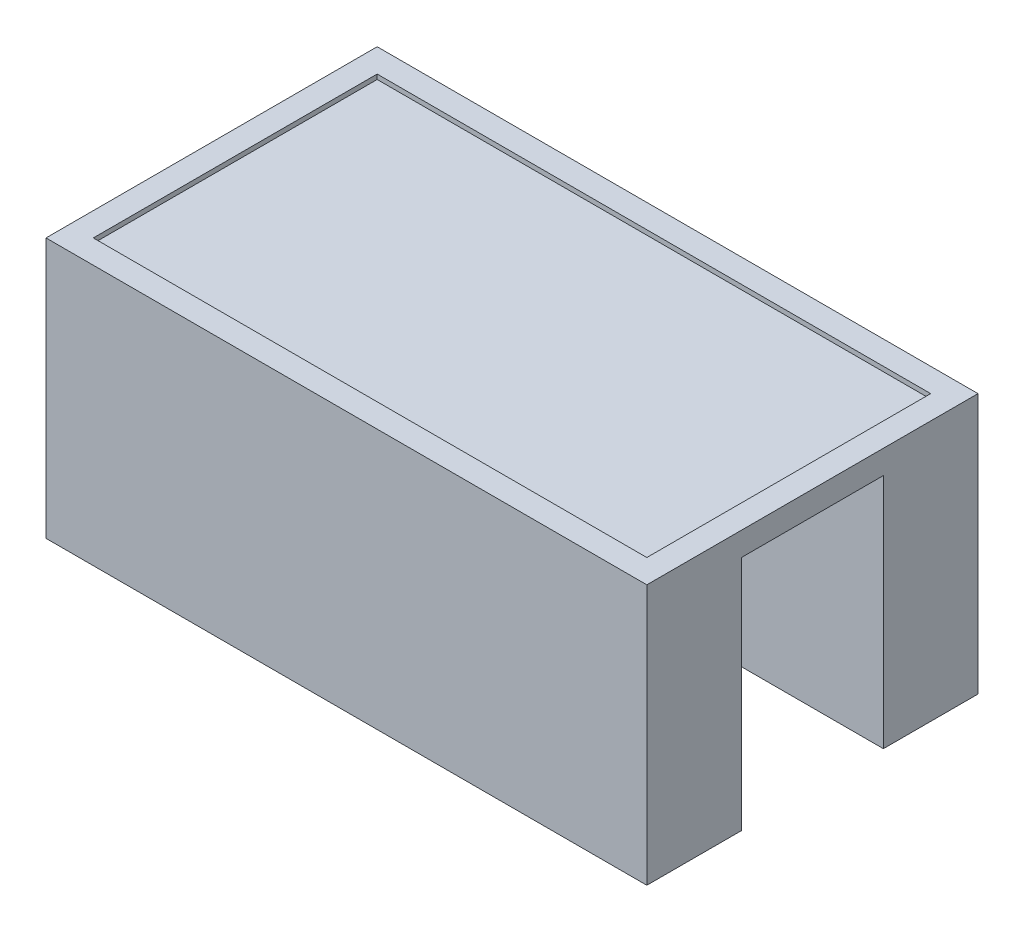
ISO-10303-21;
HEADER;
FILE_DESCRIPTION(('STEP AP214'),'2;1');
FILE_NAME('part.step','',(''),(''),'','','');
FILE_SCHEMA(('AUTOMOTIVE_DESIGN { 1 0 10303 214 1 1 1 1 }'));
ENDSEC;
DATA;
#1=APPLICATION_CONTEXT('core data for automotive mechanical design processes');
#2=APPLICATION_PROTOCOL_DEFINITION('international standard','automotive_design',2000,#1);
#3=PRODUCT_CONTEXT('',#1,'mechanical');
#4=PRODUCT('Part','Part','',(#3));
#5=PRODUCT_RELATED_PRODUCT_CATEGORY('part','',(#4));
#6=PRODUCT_DEFINITION_FORMATION('','',#4);
#7=PRODUCT_DEFINITION_CONTEXT('part definition',#1,'design');
#8=PRODUCT_DEFINITION('design','',#6,#7);
#9=PRODUCT_DEFINITION_SHAPE('','',#8);
#10=(LENGTH_UNIT() NAMED_UNIT(*) SI_UNIT(.MILLI.,.METRE.));
#11=(NAMED_UNIT(*) PLANE_ANGLE_UNIT() SI_UNIT($,.RADIAN.));
#12=(NAMED_UNIT(*) SI_UNIT($,.STERADIAN.) SOLID_ANGLE_UNIT());
#13=UNCERTAINTY_MEASURE_WITH_UNIT(LENGTH_MEASURE(1.E-05),#10,'distance_accuracy_value','');
#14=(GEOMETRIC_REPRESENTATION_CONTEXT(3) GLOBAL_UNCERTAINTY_ASSIGNED_CONTEXT((#13)) GLOBAL_UNIT_ASSIGNED_CONTEXT((#10,
#11,#12)) REPRESENTATION_CONTEXT('',''));
#15=CARTESIAN_POINT('',(0.,0.,0.));
#16=DIRECTION('',(0.,0.,1.));
#17=DIRECTION('',(1.,0.,0.));
#18=AXIS2_PLACEMENT_3D('',#15,#16,#17);
#19=CARTESIAN_POINT('',(0.,27.,0.));
#20=DIRECTION('',(0.,-1.,0.));
#21=DIRECTION('',(0.,0.,-1.));
#22=AXIS2_PLACEMENT_3D('',#19,#20,#21);
#23=PLANE('',#22);
#24=DIRECTION('',(0.,0.,-1.));
#25=VECTOR('',#24,1.);
#26=CARTESIAN_POINT('',(3.5,27.,11.5));
#27=LINE('',#26,#25);
#28=CARTESIAN_POINT('',(3.5,27.,-5.));
#29=VERTEX_POINT('',#28);
#30=CARTESIAN_POINT('',(3.50000000000001,27.,-11.5));
#31=VERTEX_POINT('',#30);
#32=EDGE_CURVE('E270',#29,#31,#27,.T.);
#33=ORIENTED_EDGE('',*,*,#32,.F.);
#34=DIRECTION('',(-1.,0.,0.));
#35=VECTOR('',#34,1.);
#36=CARTESIAN_POINT('',(-7.5,27.,-5.));
#37=LINE('',#36,#35);
#38=CARTESIAN_POINT('',(-7.5,27.,-5.));
#39=VERTEX_POINT('',#38);
#40=EDGE_CURVE('E463',#29,#39,#37,.T.);
#41=ORIENTED_EDGE('',*,*,#40,.T.);
#42=DIRECTION('',(0.,0.,-1.));
#43=VECTOR('',#42,1.);
#44=CARTESIAN_POINT('',(-7.5,27.,11.5));
#45=LINE('',#44,#43);
#46=CARTESIAN_POINT('',(-7.5,27.,-11.5));
#47=VERTEX_POINT('',#46);
#48=EDGE_CURVE('E311',#39,#47,#45,.T.);
#49=ORIENTED_EDGE('',*,*,#48,.T.);
#50=DIRECTION('',(1.,0.,0.));
#51=VECTOR('',#50,1.);
#52=CARTESIAN_POINT('',(-7.5,27.,-11.5));
#53=LINE('',#52,#51);
#54=EDGE_CURVE('E316',#47,#31,#53,.T.);
#55=ORIENTED_EDGE('',*,*,#54,.T.);
#56=EDGE_LOOP('',(#33,#41,#49,#55));
#57=FACE_BOUND('',#56,.T.);
#58=ADVANCED_FACE('F38',(#57),#23,.T.);
#59=CARTESIAN_POINT('',(-7.5,27.,11.5));
#60=VERTEX_POINT('',#59);
#61=CARTESIAN_POINT('',(-7.5,27.,5.));
#62=VERTEX_POINT('',#61);
#63=EDGE_CURVE('E312',#60,#62,#45,.T.);
#64=ORIENTED_EDGE('',*,*,#63,.T.);
#65=DIRECTION('',(1.,0.,0.));
#66=VECTOR('',#65,1.);
#67=CARTESIAN_POINT('',(-7.5,27.,5.));
#68=LINE('',#67,#66);
#69=CARTESIAN_POINT('',(3.50000000000001,27.,5.));
#70=VERTEX_POINT('',#69);
#71=EDGE_CURVE('E250',#62,#70,#68,.T.);
#72=ORIENTED_EDGE('',*,*,#71,.T.);
#73=CARTESIAN_POINT('',(3.5,27.,11.5));
#74=VERTEX_POINT('',#73);
#75=EDGE_CURVE('E281',#74,#70,#27,.T.);
#76=ORIENTED_EDGE('',*,*,#75,.F.);
#77=DIRECTION('',(-1.,0.,0.));
#78=VECTOR('',#77,1.);
#79=CARTESIAN_POINT('',(-7.5,27.,11.5));
#80=LINE('',#79,#78);
#81=EDGE_CURVE('E305',#74,#60,#80,.T.);
#82=ORIENTED_EDGE('',*,*,#81,.T.);
#83=EDGE_LOOP('',(#64,#72,#76,#82));
#84=FACE_BOUND('',#83,.T.);
#85=ADVANCED_FACE('F548',(#84),#23,.T.);
#86=CARTESIAN_POINT('',(7.5,27.,11.5));
#87=DIRECTION('',(-1.,0.,0.));
#88=DIRECTION('',(0.,0.,1.));
#89=AXIS2_PLACEMENT_3D('',#86,#87,#88);
#90=PLANE('',#89);
#91=DIRECTION('',(0.,-1.,0.));
#92=VECTOR('',#91,1.);
#93=CARTESIAN_POINT('',(7.5,38.5,5.));
#94=LINE('',#93,#92);
#95=CARTESIAN_POINT('',(7.50000000000001,38.5,5.));
#96=VERTEX_POINT('',#95);
#97=CARTESIAN_POINT('',(7.5,27.,5.));
#98=VERTEX_POINT('',#97);
#99=EDGE_CURVE('E234',#96,#98,#94,.T.);
#100=ORIENTED_EDGE('',*,*,#99,.F.);
#101=CARTESIAN_POINT('',(7.50000000000001,38.5,0.));
#102=DIRECTION('',(-1.,0.,0.));
#103=DIRECTION('',(0.,0.,1.));
#104=AXIS2_PLACEMENT_3D('',#101,#102,#103);
#105=CIRCLE('',#104,5.);
#106=CARTESIAN_POINT('',(7.50000000000001,38.5,-5.00000000000002));
#107=VERTEX_POINT('',#106);
#108=EDGE_CURVE('E721',#96,#107,#105,.T.);
#109=ORIENTED_EDGE('',*,*,#108,.T.);
#110=DIRECTION('',(0.,-1.,0.));
#111=VECTOR('',#110,1.);
#112=CARTESIAN_POINT('',(7.5,38.5,-5.));
#113=LINE('',#112,#111);
#114=CARTESIAN_POINT('',(7.5,27.,-5.));
#115=VERTEX_POINT('',#114);
#116=EDGE_CURVE('E255',#107,#115,#113,.T.);
#117=ORIENTED_EDGE('',*,*,#116,.T.);
#118=DIRECTION('',(0.,0.,1.));
#119=VECTOR('',#118,1.);
#120=CARTESIAN_POINT('',(7.5,27.,11.5));
#121=LINE('',#120,#119);
#122=CARTESIAN_POINT('',(7.5,27.,-11.5));
#123=VERTEX_POINT('',#122);
#124=EDGE_CURVE('E301',#123,#115,#121,.T.);
#125=ORIENTED_EDGE('',*,*,#124,.F.);
#126=DIRECTION('',(0.,1.,0.));
#127=VECTOR('',#126,1.);
#128=CARTESIAN_POINT('',(7.5,27.,-11.5));
#129=LINE('',#128,#127);
#130=CARTESIAN_POINT('',(7.5,50.,-11.5));
#131=VERTEX_POINT('',#130);
#132=EDGE_CURVE('E320',#123,#131,#129,.T.);
#133=ORIENTED_EDGE('',*,*,#132,.T.);
#134=DIRECTION('',(0.,0.,1.));
#135=VECTOR('',#134,1.);
#136=CARTESIAN_POINT('',(7.5,50.,11.5));
#137=LINE('',#136,#135);
#138=CARTESIAN_POINT('',(7.5,50.,11.5));
#139=VERTEX_POINT('',#138);
#140=EDGE_CURVE('E291',#131,#139,#137,.T.);
#141=ORIENTED_EDGE('',*,*,#140,.T.);
#142=DIRECTION('',(0.,1.,0.));
#143=VECTOR('',#142,1.);
#144=CARTESIAN_POINT('',(7.5,27.,11.5));
#145=LINE('',#144,#143);
#146=CARTESIAN_POINT('',(7.5,27.,11.5));
#147=VERTEX_POINT('',#146);
#148=EDGE_CURVE('E349',#147,#139,#145,.T.);
#149=ORIENTED_EDGE('',*,*,#148,.F.);
#150=EDGE_CURVE('E306',#98,#147,#121,.T.);
#151=ORIENTED_EDGE('',*,*,#150,.F.);
#152=EDGE_LOOP('',(#100,#109,#117,#125,#133,#141,#149,#151));
#153=FACE_BOUND('',#152,.T.);
#154=ADVANCED_FACE('F491',(#153),#90,.F.);
#155=CARTESIAN_POINT('',(-7.5,27.,11.5));
#156=DIRECTION('',(1.,0.,0.));
#157=DIRECTION('',(0.,0.,-1.));
#158=AXIS2_PLACEMENT_3D('',#155,#156,#157);
#159=PLANE('',#158);
#160=DIRECTION('',(0.,-1.,0.));
#161=VECTOR('',#160,1.);
#162=CARTESIAN_POINT('',(-7.5,38.5,-5.));
#163=LINE('',#162,#161);
#164=CARTESIAN_POINT('',(-7.5,38.5,-5.));
#165=VERTEX_POINT('',#164);
#166=EDGE_CURVE('E245',#165,#39,#163,.T.);
#167=ORIENTED_EDGE('',*,*,#166,.F.);
#168=CARTESIAN_POINT('',(-7.5,38.5,0.));
#169=DIRECTION('',(-1.,0.,0.));
#170=DIRECTION('',(0.,0.,1.));
#171=AXIS2_PLACEMENT_3D('',#168,#169,#170);
#172=CIRCLE('',#171,5.);
#173=CARTESIAN_POINT('',(-7.5,38.5,5.));
#174=VERTEX_POINT('',#173);
#175=EDGE_CURVE('E226',#174,#165,#172,.T.);
#176=ORIENTED_EDGE('',*,*,#175,.F.);
#177=DIRECTION('',(0.,-1.,0.));
#178=VECTOR('',#177,1.);
#179=CARTESIAN_POINT('',(-7.5,38.5,5.));
#180=LINE('',#179,#178);
#181=EDGE_CURVE('E242',#174,#62,#180,.T.);
#182=ORIENTED_EDGE('',*,*,#181,.T.);
#183=ORIENTED_EDGE('',*,*,#63,.F.);
#184=DIRECTION('',(0.,1.,0.));
#185=VECTOR('',#184,1.);
#186=CARTESIAN_POINT('',(-7.5,27.,11.5));
#187=LINE('',#186,#185);
#188=CARTESIAN_POINT('',(-7.5,50.,11.5));
#189=VERTEX_POINT('',#188);
#190=EDGE_CURVE('E345',#60,#189,#187,.T.);
#191=ORIENTED_EDGE('',*,*,#190,.T.);
#192=DIRECTION('',(0.,0.,-1.));
#193=VECTOR('',#192,1.);
#194=CARTESIAN_POINT('',(-7.5,50.,11.5));
#195=LINE('',#194,#193);
#196=CARTESIAN_POINT('',(-7.5,50.,-11.5));
#197=VERTEX_POINT('',#196);
#198=EDGE_CURVE('E329',#189,#197,#195,.T.);
#199=ORIENTED_EDGE('',*,*,#198,.T.);
#200=DIRECTION('',(0.,1.,0.));
#201=VECTOR('',#200,1.);
#202=CARTESIAN_POINT('',(-7.5,27.,-11.5));
#203=LINE('',#202,#201);
#204=EDGE_CURVE('E341',#47,#197,#203,.T.);
#205=ORIENTED_EDGE('',*,*,#204,.F.);
#206=ORIENTED_EDGE('',*,*,#48,.F.);
#207=EDGE_LOOP('',(#167,#176,#182,#183,#191,#199,#205,#206));
#208=FACE_BOUND('',#207,.T.);
#209=ADVANCED_FACE('F240',(#208),#159,.F.);
#210=ORIENTED_EDGE('',*,*,#124,.T.);
#211=CARTESIAN_POINT('',(6.50000000000001,27.,-5.));
#212=VERTEX_POINT('',#211);
#213=EDGE_CURVE('E497',#115,#212,#37,.T.);
#214=ORIENTED_EDGE('',*,*,#213,.T.);
#215=DIRECTION('',(0.,0.,1.));
#216=VECTOR('',#215,1.);
#217=CARTESIAN_POINT('',(6.5,27.,11.5));
#218=LINE('',#217,#216);
#219=CARTESIAN_POINT('',(6.50000000000001,27.,-11.5));
#220=VERTEX_POINT('',#219);
#221=EDGE_CURVE('E276',#220,#212,#218,.T.);
#222=ORIENTED_EDGE('',*,*,#221,.F.);
#223=EDGE_CURVE('E315',#220,#123,#53,.T.);
#224=ORIENTED_EDGE('',*,*,#223,.T.);
#225=EDGE_LOOP('',(#210,#214,#222,#224));
#226=FACE_BOUND('',#225,.T.);
#227=ADVANCED_FACE('F496',(#226),#23,.T.);
#228=CARTESIAN_POINT('',(6.50000000000001,27.,5.));
#229=VERTEX_POINT('',#228);
#230=CARTESIAN_POINT('',(6.5,27.,11.5));
#231=VERTEX_POINT('',#230);
#232=EDGE_CURVE('E285',#229,#231,#218,.T.);
#233=ORIENTED_EDGE('',*,*,#232,.F.);
#234=EDGE_CURVE('E441',#229,#98,#68,.T.);
#235=ORIENTED_EDGE('',*,*,#234,.T.);
#236=ORIENTED_EDGE('',*,*,#150,.T.);
#237=EDGE_CURVE('E307',#147,#231,#80,.T.);
#238=ORIENTED_EDGE('',*,*,#237,.T.);
#239=EDGE_LOOP('',(#233,#235,#236,#238));
#240=FACE_BOUND('',#239,.T.);
#241=ADVANCED_FACE('F448',(#240),#23,.T.);
#242=CARTESIAN_POINT('',(3.5,50.,11.5));
#243=DIRECTION('',(-1.,0.,0.));
#244=DIRECTION('',(0.,0.,1.));
#245=AXIS2_PLACEMENT_3D('',#242,#243,#244);
#246=PLANE('',#245);
#247=DIRECTION('',(0.,-1.,0.));
#248=VECTOR('',#247,1.);
#249=CARTESIAN_POINT('',(3.5,50.,5.));
#250=LINE('',#249,#248);
#251=CARTESIAN_POINT('',(3.50000000000001,38.5,5.));
#252=VERTEX_POINT('',#251);
#253=EDGE_CURVE('E263',#252,#70,#250,.T.);
#254=ORIENTED_EDGE('',*,*,#253,.F.);
#255=CARTESIAN_POINT('',(3.5,38.5,0.));
#256=DIRECTION('',(-1.,0.,0.));
#257=DIRECTION('',(0.,0.,1.));
#258=AXIS2_PLACEMENT_3D('',#255,#256,#257);
#259=CIRCLE('',#258,5.);
#260=CARTESIAN_POINT('',(3.5,38.5,-5.));
#261=VERTEX_POINT('',#260);
#262=EDGE_CURVE('E229',#252,#261,#259,.T.);
#263=ORIENTED_EDGE('',*,*,#262,.T.);
#264=DIRECTION('',(0.,1.,0.));
#265=VECTOR('',#264,1.);
#266=CARTESIAN_POINT('',(3.50000000000001,50.,-5.));
#267=LINE('',#266,#265);
#268=EDGE_CURVE('E266',#29,#261,#267,.T.);
#269=ORIENTED_EDGE('',*,*,#268,.F.);
#270=ORIENTED_EDGE('',*,*,#32,.T.);
#271=DIRECTION('',(0.,-1.,0.));
#272=VECTOR('',#271,1.);
#273=CARTESIAN_POINT('',(3.50000000000001,50.,-11.5));
#274=LINE('',#273,#272);
#275=CARTESIAN_POINT('',(3.50000000000001,50.,-11.5));
#276=VERTEX_POINT('',#275);
#277=EDGE_CURVE('E280',#276,#31,#274,.T.);
#278=ORIENTED_EDGE('',*,*,#277,.F.);
#279=DIRECTION('',(0.,0.,-1.));
#280=VECTOR('',#279,1.);
#281=CARTESIAN_POINT('',(3.5,50.,11.5));
#282=LINE('',#281,#280);
#283=CARTESIAN_POINT('',(3.5,50.,11.5));
#284=VERTEX_POINT('',#283);
#285=EDGE_CURVE('E271',#284,#276,#282,.T.);
#286=ORIENTED_EDGE('',*,*,#285,.F.);
#287=DIRECTION('',(0.,-1.,0.));
#288=VECTOR('',#287,1.);
#289=CARTESIAN_POINT('',(3.5,50.,11.5));
#290=LINE('',#289,#288);
#291=EDGE_CURVE('E288',#284,#74,#290,.T.);
#292=ORIENTED_EDGE('',*,*,#291,.T.);
#293=ORIENTED_EDGE('',*,*,#75,.T.);
#294=EDGE_LOOP('',(#254,#263,#269,#270,#278,#286,#292,#293));
#295=FACE_BOUND('',#294,.T.);
#296=ADVANCED_FACE('F456',(#295),#246,.F.);
#297=CARTESIAN_POINT('',(6.5,50.,11.5));
#298=DIRECTION('',(1.,0.,0.));
#299=DIRECTION('',(0.,0.,-1.));
#300=AXIS2_PLACEMENT_3D('',#297,#298,#299);
#301=PLANE('',#300);
#302=DIRECTION('',(0.,-1.,0.));
#303=VECTOR('',#302,1.);
#304=CARTESIAN_POINT('',(6.50000000000001,50.,-5.));
#305=LINE('',#304,#303);
#306=CARTESIAN_POINT('',(6.50000000000001,38.5,-5.));
#307=VERTEX_POINT('',#306);
#308=EDGE_CURVE('E11',#307,#212,#305,.T.);
#309=ORIENTED_EDGE('',*,*,#308,.F.);
#310=CARTESIAN_POINT('',(6.50000000000001,38.5,0.));
#311=DIRECTION('',(1.,0.,0.));
#312=DIRECTION('',(0.,0.,-1.));
#313=AXIS2_PLACEMENT_3D('',#310,#311,#312);
#314=CIRCLE('',#313,5.);
#315=CARTESIAN_POINT('',(6.50000000000001,38.5,5.));
#316=VERTEX_POINT('',#315);
#317=EDGE_CURVE('E446',#307,#316,#314,.T.);
#318=ORIENTED_EDGE('',*,*,#317,.T.);
#319=DIRECTION('',(0.,1.,0.));
#320=VECTOR('',#319,1.);
#321=CARTESIAN_POINT('',(6.50000000000001,50.,5.));
#322=LINE('',#321,#320);
#323=EDGE_CURVE('E47',#229,#316,#322,.T.);
#324=ORIENTED_EDGE('',*,*,#323,.F.);
#325=ORIENTED_EDGE('',*,*,#232,.T.);
#326=DIRECTION('',(0.,-1.,0.));
#327=VECTOR('',#326,1.);
#328=CARTESIAN_POINT('',(6.5,50.,11.5));
#329=LINE('',#328,#327);
#330=CARTESIAN_POINT('',(6.5,50.,11.5));
#331=VERTEX_POINT('',#330);
#332=EDGE_CURVE('E292',#331,#231,#329,.T.);
#333=ORIENTED_EDGE('',*,*,#332,.F.);
#334=DIRECTION('',(0.,0.,1.));
#335=VECTOR('',#334,1.);
#336=CARTESIAN_POINT('',(6.5,50.,11.5));
#337=LINE('',#336,#335);
#338=CARTESIAN_POINT('',(6.50000000000001,50.,-11.5));
#339=VERTEX_POINT('',#338);
#340=EDGE_CURVE('E275',#339,#331,#337,.T.);
#341=ORIENTED_EDGE('',*,*,#340,.F.);
#342=DIRECTION('',(0.,-1.,0.));
#343=VECTOR('',#342,1.);
#344=CARTESIAN_POINT('',(6.50000000000001,50.,-11.5));
#345=LINE('',#344,#343);
#346=EDGE_CURVE('E62',#339,#220,#345,.T.);
#347=ORIENTED_EDGE('',*,*,#346,.T.);
#348=ORIENTED_EDGE('',*,*,#221,.T.);
#349=EDGE_LOOP('',(#309,#318,#324,#325,#333,#341,#347,#348));
#350=FACE_BOUND('',#349,.T.);
#351=ADVANCED_FACE('F445',(#350),#301,.F.);
#352=CARTESIAN_POINT('',(-7.5,27.,11.5));
#353=DIRECTION('',(0.,0.,-1.));
#354=DIRECTION('',(-1.,0.,0.));
#355=AXIS2_PLACEMENT_3D('',#352,#353,#354);
#356=PLANE('',#355);
#357=ORIENTED_EDGE('',*,*,#81,.F.);
#358=ORIENTED_EDGE('',*,*,#291,.F.);
#359=DIRECTION('',(-1.,0.,0.));
#360=VECTOR('',#359,1.);
#361=CARTESIAN_POINT('',(-7.5,50.,11.5));
#362=LINE('',#361,#360);
#363=EDGE_CURVE('E324',#284,#189,#362,.T.);
#364=ORIENTED_EDGE('',*,*,#363,.T.);
#365=ORIENTED_EDGE('',*,*,#190,.F.);
#366=EDGE_LOOP('',(#357,#358,#364,#365));
#367=FACE_BOUND('',#366,.T.);
#368=ADVANCED_FACE('F475',(#367),#356,.F.);
#369=CARTESIAN_POINT('',(-7.5,27.,-11.5));
#370=DIRECTION('',(0.,0.,1.));
#371=DIRECTION('',(1.,0.,0.));
#372=AXIS2_PLACEMENT_3D('',#369,#370,#371);
#373=PLANE('',#372);
#374=DIRECTION('',(1.,0.,0.));
#375=VECTOR('',#374,1.);
#376=CARTESIAN_POINT('',(-7.5,50.,-11.5));
#377=LINE('',#376,#375);
#378=EDGE_CURVE('E334',#197,#276,#377,.T.);
#379=ORIENTED_EDGE('',*,*,#378,.T.);
#380=ORIENTED_EDGE('',*,*,#277,.T.);
#381=ORIENTED_EDGE('',*,*,#54,.F.);
#382=ORIENTED_EDGE('',*,*,#204,.T.);
#383=EDGE_LOOP('',(#379,#380,#381,#382));
#384=FACE_BOUND('',#383,.T.);
#385=ADVANCED_FACE('F461',(#384),#373,.F.);
#386=CARTESIAN_POINT('',(0.,50.,0.));
#387=DIRECTION('',(0.,1.,0.));
#388=DIRECTION('',(0.,0.,1.));
#389=AXIS2_PLACEMENT_3D('',#386,#387,#388);
#390=PLANE('',#389);
#391=ORIENTED_EDGE('',*,*,#363,.F.);
#392=ORIENTED_EDGE('',*,*,#285,.T.);
#393=ORIENTED_EDGE('',*,*,#378,.F.);
#394=ORIENTED_EDGE('',*,*,#198,.F.);
#395=EDGE_LOOP('',(#391,#392,#393,#394));
#396=FACE_BOUND('',#395,.T.);
#397=DIRECTION('',(0.,0.,-1.));
#398=VECTOR('',#397,1.);
#399=CARTESIAN_POINT('',(63.5,50.,-15.));
#400=LINE('',#399,#398);
#401=CARTESIAN_POINT('',(63.5,50.,15.));
#402=VERTEX_POINT('',#401);
#403=CARTESIAN_POINT('',(63.5,50.,-15.));
#404=VERTEX_POINT('',#403);
#405=EDGE_CURVE('E354',#402,#404,#400,.T.);
#406=ORIENTED_EDGE('',*,*,#405,.F.);
#407=DIRECTION('',(1.,0.,0.));
#408=VECTOR('',#407,1.);
#409=CARTESIAN_POINT('',(-63.5,50.,15.));
#410=LINE('',#409,#408);
#411=CARTESIAN_POINT('',(-63.5,50.,15.));
#412=VERTEX_POINT('',#411);
#413=EDGE_CURVE('E366',#412,#402,#410,.T.);
#414=ORIENTED_EDGE('',*,*,#413,.F.);
#415=DIRECTION('',(0.,0.,1.));
#416=VECTOR('',#415,1.);
#417=CARTESIAN_POINT('',(-63.5,50.,-15.));
#418=LINE('',#417,#416);
#419=CARTESIAN_POINT('',(-63.5,50.,-15.));
#420=VERTEX_POINT('',#419);
#421=EDGE_CURVE('E362',#420,#412,#418,.T.);
#422=ORIENTED_EDGE('',*,*,#421,.F.);
#423=DIRECTION('',(-1.,0.,0.));
#424=VECTOR('',#423,1.);
#425=CARTESIAN_POINT('',(-63.5,50.,-15.));
#426=LINE('',#425,#424);
#427=EDGE_CURVE('E358',#404,#420,#426,.T.);
#428=ORIENTED_EDGE('',*,*,#427,.F.);
#429=EDGE_LOOP('',(#406,#414,#422,#428));
#430=FACE_BOUND('',#429,.T.);
#431=ORIENTED_EDGE('',*,*,#140,.F.);
#432=EDGE_CURVE('E333',#339,#131,#377,.T.);
#433=ORIENTED_EDGE('',*,*,#432,.F.);
#434=ORIENTED_EDGE('',*,*,#340,.T.);
#435=EDGE_CURVE('E325',#139,#331,#362,.T.);
#436=ORIENTED_EDGE('',*,*,#435,.F.);
#437=EDGE_LOOP('',(#431,#433,#434,#436));
#438=FACE_BOUND('',#437,.T.);
#439=ADVANCED_FACE('F469',(#396,#430,#438),#390,.F.);
#440=CARTESIAN_POINT('',(63.5,55.,-35.));
#441=DIRECTION('',(-1.,0.,0.));
#442=DIRECTION('',(0.,0.,1.));
#443=AXIS2_PLACEMENT_3D('',#440,#441,#442);
#444=PLANE('',#443);
#445=DIRECTION('',(0.,-1.,0.));
#446=VECTOR('',#445,1.);
#447=CARTESIAN_POINT('',(63.5,50.,-15.));
#448=LINE('',#447,#446);
#449=CARTESIAN_POINT('',(63.5,0.,-15.));
#450=VERTEX_POINT('',#449);
#451=EDGE_CURVE('E385',#404,#450,#448,.T.);
#452=ORIENTED_EDGE('',*,*,#451,.T.);
#453=DIRECTION('',(0.,0.,-1.));
#454=VECTOR('',#453,1.);
#455=CARTESIAN_POINT('',(63.5,0.,-35.));
#456=LINE('',#455,#454);
#457=CARTESIAN_POINT('',(63.5,0.,-35.));
#458=VERTEX_POINT('',#457);
#459=EDGE_CURVE('E389',#450,#458,#456,.T.);
#460=ORIENTED_EDGE('',*,*,#459,.T.);
#461=DIRECTION('',(0.,-1.,0.));
#462=VECTOR('',#461,1.);
#463=CARTESIAN_POINT('',(63.5,55.,-35.));
#464=LINE('',#463,#462);
#465=CARTESIAN_POINT('',(63.5,55.,-35.));
#466=VERTEX_POINT('',#465);
#467=EDGE_CURVE('E430',#466,#458,#464,.T.);
#468=ORIENTED_EDGE('',*,*,#467,.F.);
#469=DIRECTION('',(0.,0.,-1.));
#470=VECTOR('',#469,1.);
#471=CARTESIAN_POINT('',(63.5,55.,-35.));
#472=LINE('',#471,#470);
#473=CARTESIAN_POINT('',(63.5,55.,35.));
#474=VERTEX_POINT('',#473);
#475=EDGE_CURVE('E390',#474,#466,#472,.T.);
#476=ORIENTED_EDGE('',*,*,#475,.F.);
#477=DIRECTION('',(0.,-1.,0.));
#478=VECTOR('',#477,1.);
#479=CARTESIAN_POINT('',(63.5,55.,35.));
#480=LINE('',#479,#478);
#481=CARTESIAN_POINT('',(63.5,0.,35.));
#482=VERTEX_POINT('',#481);
#483=EDGE_CURVE('E404',#474,#482,#480,.T.);
#484=ORIENTED_EDGE('',*,*,#483,.T.);
#485=CARTESIAN_POINT('',(63.5,0.,15.));
#486=VERTEX_POINT('',#485);
#487=EDGE_CURVE('E405',#482,#486,#456,.T.);
#488=ORIENTED_EDGE('',*,*,#487,.T.);
#489=DIRECTION('',(0.,-1.,0.));
#490=VECTOR('',#489,1.);
#491=CARTESIAN_POINT('',(63.5,50.,15.));
#492=LINE('',#491,#490);
#493=EDGE_CURVE('E369',#402,#486,#492,.T.);
#494=ORIENTED_EDGE('',*,*,#493,.F.);
#495=ORIENTED_EDGE('',*,*,#405,.T.);
#496=EDGE_LOOP('',(#452,#460,#468,#476,#484,#488,#494,#495));
#497=FACE_BOUND('',#496,.T.);
#498=ADVANCED_FACE('F40',(#497),#444,.F.);
#499=CARTESIAN_POINT('',(-63.5,55.,-35.));
#500=DIRECTION('',(1.,0.,0.));
#501=DIRECTION('',(0.,0.,-1.));
#502=AXIS2_PLACEMENT_3D('',#499,#500,#501);
#503=PLANE('',#502);
#504=DIRECTION('',(0.,-1.,0.));
#505=VECTOR('',#504,1.);
#506=CARTESIAN_POINT('',(-63.5,50.,-15.));
#507=LINE('',#506,#505);
#508=CARTESIAN_POINT('',(-63.5,0.,-15.));
#509=VERTEX_POINT('',#508);
#510=EDGE_CURVE('E382',#420,#509,#507,.T.);
#511=ORIENTED_EDGE('',*,*,#510,.F.);
#512=ORIENTED_EDGE('',*,*,#421,.T.);
#513=DIRECTION('',(0.,-1.,0.));
#514=VECTOR('',#513,1.);
#515=CARTESIAN_POINT('',(-63.5,50.,15.));
#516=LINE('',#515,#514);
#517=CARTESIAN_POINT('',(-63.5,0.,15.));
#518=VERTEX_POINT('',#517);
#519=EDGE_CURVE('E378',#412,#518,#516,.T.);
#520=ORIENTED_EDGE('',*,*,#519,.T.);
#521=DIRECTION('',(0.,0.,1.));
#522=VECTOR('',#521,1.);
#523=CARTESIAN_POINT('',(-63.5,0.,-35.));
#524=LINE('',#523,#522);
#525=CARTESIAN_POINT('',(-63.5,0.,35.));
#526=VERTEX_POINT('',#525);
#527=EDGE_CURVE('E412',#518,#526,#524,.T.);
#528=ORIENTED_EDGE('',*,*,#527,.T.);
#529=DIRECTION('',(0.,-1.,0.));
#530=VECTOR('',#529,1.);
#531=CARTESIAN_POINT('',(-63.5,55.,35.));
#532=LINE('',#531,#530);
#533=CARTESIAN_POINT('',(-63.5,55.,35.));
#534=VERTEX_POINT('',#533);
#535=EDGE_CURVE('E422',#534,#526,#532,.T.);
#536=ORIENTED_EDGE('',*,*,#535,.F.);
#537=DIRECTION('',(0.,0.,1.));
#538=VECTOR('',#537,1.);
#539=CARTESIAN_POINT('',(-63.5,55.,-35.));
#540=LINE('',#539,#538);
#541=CARTESIAN_POINT('',(-63.5,55.,-35.));
#542=VERTEX_POINT('',#541);
#543=EDGE_CURVE('E398',#542,#534,#540,.T.);
#544=ORIENTED_EDGE('',*,*,#543,.F.);
#545=DIRECTION('',(0.,-1.,0.));
#546=VECTOR('',#545,1.);
#547=CARTESIAN_POINT('',(-63.5,55.,-35.));
#548=LINE('',#547,#546);
#549=CARTESIAN_POINT('',(-63.5,0.,-35.));
#550=VERTEX_POINT('',#549);
#551=EDGE_CURVE('E426',#542,#550,#548,.T.);
#552=ORIENTED_EDGE('',*,*,#551,.T.);
#553=EDGE_CURVE('E413',#550,#509,#524,.T.);
#554=ORIENTED_EDGE('',*,*,#553,.T.);
#555=EDGE_LOOP('',(#511,#512,#520,#528,#536,#544,#552,#554));
#556=FACE_BOUND('',#555,.T.);
#557=ADVANCED_FACE('F505',(#556),#503,.F.);
#558=CARTESIAN_POINT('',(0.,0.,0.));
#559=DIRECTION('',(0.,1.,0.));
#560=DIRECTION('',(0.,0.,1.));
#561=AXIS2_PLACEMENT_3D('',#558,#559,#560);
#562=PLANE('',#561);
#563=DIRECTION('',(-1.,0.,0.));
#564=VECTOR('',#563,1.);
#565=CARTESIAN_POINT('',(-63.5,0.,-15.));
#566=LINE('',#565,#564);
#567=EDGE_CURVE('E353',#450,#509,#566,.T.);
#568=ORIENTED_EDGE('',*,*,#567,.T.);
#569=ORIENTED_EDGE('',*,*,#553,.F.);
#570=DIRECTION('',(-1.,0.,0.));
#571=VECTOR('',#570,1.);
#572=CARTESIAN_POINT('',(-63.5,0.,-35.));
#573=LINE('',#572,#571);
#574=EDGE_CURVE('E409',#458,#550,#573,.T.);
#575=ORIENTED_EDGE('',*,*,#574,.F.);
#576=ORIENTED_EDGE('',*,*,#459,.F.);
#577=EDGE_LOOP('',(#568,#569,#575,#576));
#578=FACE_BOUND('',#577,.T.);
#579=ADVANCED_FACE('F526',(#578),#562,.F.);
#580=DIRECTION('',(1.,0.,0.));
#581=VECTOR('',#580,1.);
#582=CARTESIAN_POINT('',(-63.5,0.,15.));
#583=LINE('',#582,#581);
#584=EDGE_CURVE('E359',#518,#486,#583,.T.);
#585=ORIENTED_EDGE('',*,*,#584,.T.);
#586=ORIENTED_EDGE('',*,*,#487,.F.);
#587=DIRECTION('',(1.,0.,0.));
#588=VECTOR('',#587,1.);
#589=CARTESIAN_POINT('',(-63.5,0.,35.));
#590=LINE('',#589,#588);
#591=EDGE_CURVE('E395',#526,#482,#590,.T.);
#592=ORIENTED_EDGE('',*,*,#591,.F.);
#593=ORIENTED_EDGE('',*,*,#527,.F.);
#594=EDGE_LOOP('',(#585,#586,#592,#593));
#595=FACE_BOUND('',#594,.T.);
#596=ADVANCED_FACE('F514',(#595),#562,.F.);
#597=CARTESIAN_POINT('',(-63.5,55.,-35.));
#598=DIRECTION('',(0.,0.,1.));
#599=DIRECTION('',(1.,0.,0.));
#600=AXIS2_PLACEMENT_3D('',#597,#598,#599);
#601=PLANE('',#600);
#602=ORIENTED_EDGE('',*,*,#574,.T.);
#603=ORIENTED_EDGE('',*,*,#551,.F.);
#604=DIRECTION('',(-1.,0.,0.));
#605=VECTOR('',#604,1.);
#606=CARTESIAN_POINT('',(-63.5,55.,-35.));
#607=LINE('',#606,#605);
#608=EDGE_CURVE('E394',#466,#542,#607,.T.);
#609=ORIENTED_EDGE('',*,*,#608,.F.);
#610=ORIENTED_EDGE('',*,*,#467,.T.);
#611=EDGE_LOOP('',(#602,#603,#609,#610));
#612=FACE_BOUND('',#611,.T.);
#613=ADVANCED_FACE('F793',(#612),#601,.F.);
#614=CARTESIAN_POINT('',(-63.5,55.,35.));
#615=DIRECTION('',(0.,0.,-1.));
#616=DIRECTION('',(-1.,0.,0.));
#617=AXIS2_PLACEMENT_3D('',#614,#615,#616);
#618=PLANE('',#617);
#619=ORIENTED_EDGE('',*,*,#591,.T.);
#620=ORIENTED_EDGE('',*,*,#483,.F.);
#621=DIRECTION('',(1.,0.,0.));
#622=VECTOR('',#621,1.);
#623=CARTESIAN_POINT('',(-63.5,55.,35.));
#624=LINE('',#623,#622);
#625=EDGE_CURVE('E401',#534,#474,#624,.T.);
#626=ORIENTED_EDGE('',*,*,#625,.F.);
#627=ORIENTED_EDGE('',*,*,#535,.T.);
#628=EDGE_LOOP('',(#619,#620,#626,#627));
#629=FACE_BOUND('',#628,.T.);
#630=ADVANCED_FACE('F511',(#629),#618,.F.);
#631=CARTESIAN_POINT('',(0.,55.,0.));
#632=DIRECTION('',(0.,1.,0.));
#633=DIRECTION('',(0.,0.,1.));
#634=AXIS2_PLACEMENT_3D('',#631,#632,#633);
#635=PLANE('',#634);
#636=DIRECTION('',(0.,0.,-1.));
#637=VECTOR('',#636,1.);
#638=CARTESIAN_POINT('',(58.5,55.,-30.));
#639=LINE('',#638,#637);
#640=CARTESIAN_POINT('',(58.5,55.,30.));
#641=VERTEX_POINT('',#640);
#642=CARTESIAN_POINT('',(58.5,55.,-30.));
#643=VERTEX_POINT('',#642);
#644=EDGE_CURVE('E54',#641,#643,#639,.T.);
#645=ORIENTED_EDGE('',*,*,#644,.F.);
#646=DIRECTION('',(1.,0.,0.));
#647=VECTOR('',#646,1.);
#648=CARTESIAN_POINT('',(-58.5,55.,30.));
#649=LINE('',#648,#647);
#650=CARTESIAN_POINT('',(-58.5,55.,30.));
#651=VERTEX_POINT('',#650);
#652=EDGE_CURVE('E761',#651,#641,#649,.T.);
#653=ORIENTED_EDGE('',*,*,#652,.F.);
#654=DIRECTION('',(0.,0.,1.));
#655=VECTOR('',#654,1.);
#656=CARTESIAN_POINT('',(-58.5,55.,-30.));
#657=LINE('',#656,#655);
#658=CARTESIAN_POINT('',(-58.5,55.,-30.));
#659=VERTEX_POINT('',#658);
#660=EDGE_CURVE('E765',#659,#651,#657,.T.);
#661=ORIENTED_EDGE('',*,*,#660,.F.);
#662=DIRECTION('',(-1.,0.,0.));
#663=VECTOR('',#662,1.);
#664=CARTESIAN_POINT('',(-58.5,55.,-30.));
#665=LINE('',#664,#663);
#666=EDGE_CURVE('E769',#643,#659,#665,.T.);
#667=ORIENTED_EDGE('',*,*,#666,.F.);
#668=EDGE_LOOP('',(#645,#653,#661,#667));
#669=FACE_BOUND('',#668,.T.);
#670=ORIENTED_EDGE('',*,*,#475,.T.);
#671=ORIENTED_EDGE('',*,*,#608,.T.);
#672=ORIENTED_EDGE('',*,*,#543,.T.);
#673=ORIENTED_EDGE('',*,*,#625,.T.);
#674=EDGE_LOOP('',(#670,#671,#672,#673));
#675=FACE_BOUND('',#674,.T.);
#676=ADVANCED_FACE('F520',(#669,#675),#635,.T.);
#677=CARTESIAN_POINT('',(-63.5,50.,-15.));
#678=DIRECTION('',(0.,0.,1.));
#679=DIRECTION('',(1.,0.,0.));
#680=AXIS2_PLACEMENT_3D('',#677,#678,#679);
#681=PLANE('',#680);
#682=ORIENTED_EDGE('',*,*,#567,.F.);
#683=ORIENTED_EDGE('',*,*,#451,.F.);
#684=ORIENTED_EDGE('',*,*,#427,.T.);
#685=ORIENTED_EDGE('',*,*,#510,.T.);
#686=EDGE_LOOP('',(#682,#683,#684,#685));
#687=FACE_BOUND('',#686,.T.);
#688=ADVANCED_FACE('F530',(#687),#681,.T.);
#689=CARTESIAN_POINT('',(-63.5,50.,15.));
#690=DIRECTION('',(0.,0.,-1.));
#691=DIRECTION('',(-1.,0.,0.));
#692=AXIS2_PLACEMENT_3D('',#689,#690,#691);
#693=PLANE('',#692);
#694=ORIENTED_EDGE('',*,*,#584,.F.);
#695=ORIENTED_EDGE('',*,*,#519,.F.);
#696=ORIENTED_EDGE('',*,*,#413,.T.);
#697=ORIENTED_EDGE('',*,*,#493,.T.);
#698=EDGE_LOOP('',(#694,#695,#696,#697));
#699=FACE_BOUND('',#698,.T.);
#700=ADVANCED_FACE('F535',(#699),#693,.T.);
#701=ORIENTED_EDGE('',*,*,#435,.T.);
#702=ORIENTED_EDGE('',*,*,#332,.T.);
#703=ORIENTED_EDGE('',*,*,#237,.F.);
#704=ORIENTED_EDGE('',*,*,#148,.T.);
#705=EDGE_LOOP('',(#701,#702,#703,#704));
#706=FACE_BOUND('',#705,.T.);
#707=ADVANCED_FACE('F537',(#706),#356,.F.);
#708=ORIENTED_EDGE('',*,*,#223,.F.);
#709=ORIENTED_EDGE('',*,*,#346,.F.);
#710=ORIENTED_EDGE('',*,*,#432,.T.);
#711=ORIENTED_EDGE('',*,*,#132,.F.);
#712=EDGE_LOOP('',(#708,#709,#710,#711));
#713=FACE_BOUND('',#712,.T.);
#714=ADVANCED_FACE('F486',(#713),#373,.F.);
#715=CARTESIAN_POINT('',(-7.5,38.5,5.));
#716=DIRECTION('',(0.,0.,-1.));
#717=DIRECTION('',(-1.,0.,0.));
#718=AXIS2_PLACEMENT_3D('',#715,#716,#717);
#719=PLANE('',#718);
#720=ORIENTED_EDGE('',*,*,#323,.T.);
#721=DIRECTION('',(1.,0.,0.));
#722=VECTOR('',#721,1.);
#723=CARTESIAN_POINT('',(-7.5,38.5,5.));
#724=LINE('',#723,#722);
#725=EDGE_CURVE('E235',#316,#96,#724,.T.);
#726=ORIENTED_EDGE('',*,*,#725,.T.);
#727=ORIENTED_EDGE('',*,*,#99,.T.);
#728=ORIENTED_EDGE('',*,*,#234,.F.);
#729=EDGE_LOOP('',(#720,#726,#727,#728));
#730=FACE_BOUND('',#729,.T.);
#731=ADVANCED_FACE('F438',(#730),#719,.T.);
#732=CARTESIAN_POINT('',(-7.5,38.5,-5.));
#733=DIRECTION('',(0.,0.,1.));
#734=DIRECTION('',(1.,0.,0.));
#735=AXIS2_PLACEMENT_3D('',#732,#733,#734);
#736=PLANE('',#735);
#737=ORIENTED_EDGE('',*,*,#308,.T.);
#738=ORIENTED_EDGE('',*,*,#213,.F.);
#739=ORIENTED_EDGE('',*,*,#116,.F.);
#740=DIRECTION('',(-1.,0.,0.));
#741=VECTOR('',#740,1.);
#742=CARTESIAN_POINT('',(-7.5,38.5,-5.));
#743=LINE('',#742,#741);
#744=EDGE_CURVE('E723',#107,#307,#743,.T.);
#745=ORIENTED_EDGE('',*,*,#744,.T.);
#746=EDGE_LOOP('',(#737,#738,#739,#745));
#747=FACE_BOUND('',#746,.T.);
#748=ADVANCED_FACE('F582',(#747),#736,.T.);
#749=ORIENTED_EDGE('',*,*,#268,.T.);
#750=EDGE_CURVE('E725',#261,#165,#743,.T.);
#751=ORIENTED_EDGE('',*,*,#750,.T.);
#752=ORIENTED_EDGE('',*,*,#166,.T.);
#753=ORIENTED_EDGE('',*,*,#40,.F.);
#754=EDGE_LOOP('',(#749,#751,#752,#753));
#755=FACE_BOUND('',#754,.T.);
#756=ADVANCED_FACE('F587',(#755),#736,.T.);
#757=ORIENTED_EDGE('',*,*,#253,.T.);
#758=ORIENTED_EDGE('',*,*,#71,.F.);
#759=ORIENTED_EDGE('',*,*,#181,.F.);
#760=EDGE_CURVE('E223',#174,#252,#724,.T.);
#761=ORIENTED_EDGE('',*,*,#760,.T.);
#762=EDGE_LOOP('',(#757,#758,#759,#761));
#763=FACE_BOUND('',#762,.T.);
#764=ADVANCED_FACE('F248',(#763),#719,.T.);
#765=CARTESIAN_POINT('',(58.5,54.,-30.));
#766=DIRECTION('',(1.,0.,0.));
#767=DIRECTION('',(0.,0.,-1.));
#768=AXIS2_PLACEMENT_3D('',#765,#766,#767);
#769=PLANE('',#768);
#770=ORIENTED_EDGE('',*,*,#644,.T.);
#771=DIRECTION('',(0.,1.,0.));
#772=VECTOR('',#771,1.);
#773=CARTESIAN_POINT('',(58.5,54.,-30.));
#774=LINE('',#773,#772);
#775=CARTESIAN_POINT('',(58.5,54.,-30.));
#776=VERTEX_POINT('',#775);
#777=EDGE_CURVE('E743',#776,#643,#774,.T.);
#778=ORIENTED_EDGE('',*,*,#777,.F.);
#779=DIRECTION('',(0.,0.,-1.));
#780=VECTOR('',#779,1.);
#781=CARTESIAN_POINT('',(58.5,54.,-30.));
#782=LINE('',#781,#780);
#783=CARTESIAN_POINT('',(58.5,54.,30.));
#784=VERTEX_POINT('',#783);
#785=EDGE_CURVE('E757',#784,#776,#782,.T.);
#786=ORIENTED_EDGE('',*,*,#785,.F.);
#787=DIRECTION('',(0.,1.,0.));
#788=VECTOR('',#787,1.);
#789=CARTESIAN_POINT('',(58.5,54.,30.));
#790=LINE('',#789,#788);
#791=EDGE_CURVE('E735',#784,#641,#790,.T.);
#792=ORIENTED_EDGE('',*,*,#791,.T.);
#793=EDGE_LOOP('',(#770,#778,#786,#792));
#794=FACE_BOUND('',#793,.T.);
#795=ADVANCED_FACE('F592',(#794),#769,.F.);
#796=CARTESIAN_POINT('',(-58.5,54.,30.));
#797=DIRECTION('',(0.,0.,1.));
#798=DIRECTION('',(1.,0.,0.));
#799=AXIS2_PLACEMENT_3D('',#796,#797,#798);
#800=PLANE('',#799);
#801=ORIENTED_EDGE('',*,*,#652,.T.);
#802=ORIENTED_EDGE('',*,*,#791,.F.);
#803=DIRECTION('',(1.,0.,0.));
#804=VECTOR('',#803,1.);
#805=CARTESIAN_POINT('',(-58.5,54.,30.));
#806=LINE('',#805,#804);
#807=CARTESIAN_POINT('',(-58.5,54.,30.));
#808=VERTEX_POINT('',#807);
#809=EDGE_CURVE('E746',#808,#784,#806,.T.);
#810=ORIENTED_EDGE('',*,*,#809,.F.);
#811=DIRECTION('',(0.,1.,0.));
#812=VECTOR('',#811,1.);
#813=CARTESIAN_POINT('',(-58.5,54.,30.));
#814=LINE('',#813,#812);
#815=EDGE_CURVE('E737',#808,#651,#814,.T.);
#816=ORIENTED_EDGE('',*,*,#815,.T.);
#817=EDGE_LOOP('',(#801,#802,#810,#816));
#818=FACE_BOUND('',#817,.T.);
#819=ADVANCED_FACE('F598',(#818),#800,.F.);
#820=CARTESIAN_POINT('',(-58.5,54.,-30.));
#821=DIRECTION('',(-1.,0.,0.));
#822=DIRECTION('',(0.,0.,1.));
#823=AXIS2_PLACEMENT_3D('',#820,#821,#822);
#824=PLANE('',#823);
#825=ORIENTED_EDGE('',*,*,#660,.T.);
#826=ORIENTED_EDGE('',*,*,#815,.F.);
#827=DIRECTION('',(0.,0.,1.));
#828=VECTOR('',#827,1.);
#829=CARTESIAN_POINT('',(-58.5,54.,-30.));
#830=LINE('',#829,#828);
#831=CARTESIAN_POINT('',(-58.5,54.,-30.));
#832=VERTEX_POINT('',#831);
#833=EDGE_CURVE('E749',#832,#808,#830,.T.);
#834=ORIENTED_EDGE('',*,*,#833,.F.);
#835=DIRECTION('',(0.,1.,0.));
#836=VECTOR('',#835,1.);
#837=CARTESIAN_POINT('',(-58.5,54.,-30.));
#838=LINE('',#837,#836);
#839=EDGE_CURVE('E740',#832,#659,#838,.T.);
#840=ORIENTED_EDGE('',*,*,#839,.T.);
#841=EDGE_LOOP('',(#825,#826,#834,#840));
#842=FACE_BOUND('',#841,.T.);
#843=ADVANCED_FACE('F670',(#842),#824,.F.);
#844=CARTESIAN_POINT('',(-58.5,54.,-30.));
#845=DIRECTION('',(0.,0.,-1.));
#846=DIRECTION('',(-1.,0.,0.));
#847=AXIS2_PLACEMENT_3D('',#844,#845,#846);
#848=PLANE('',#847);
#849=ORIENTED_EDGE('',*,*,#666,.T.);
#850=ORIENTED_EDGE('',*,*,#839,.F.);
#851=DIRECTION('',(-1.,0.,0.));
#852=VECTOR('',#851,1.);
#853=CARTESIAN_POINT('',(-58.5,54.,-30.));
#854=LINE('',#853,#852);
#855=EDGE_CURVE('E753',#776,#832,#854,.T.);
#856=ORIENTED_EDGE('',*,*,#855,.F.);
#857=ORIENTED_EDGE('',*,*,#777,.T.);
#858=EDGE_LOOP('',(#849,#850,#856,#857));
#859=FACE_BOUND('',#858,.T.);
#860=ADVANCED_FACE('F679',(#859),#848,.F.);
#861=CARTESIAN_POINT('',(0.,54.,0.));
#862=DIRECTION('',(0.,1.,0.));
#863=DIRECTION('',(0.,0.,1.));
#864=AXIS2_PLACEMENT_3D('',#861,#862,#863);
#865=PLANE('',#864);
#866=ORIENTED_EDGE('',*,*,#785,.T.);
#867=ORIENTED_EDGE('',*,*,#855,.T.);
#868=ORIENTED_EDGE('',*,*,#833,.T.);
#869=ORIENTED_EDGE('',*,*,#809,.T.);
#870=EDGE_LOOP('',(#866,#867,#868,#869));
#871=FACE_BOUND('',#870,.T.);
#872=ADVANCED_FACE('F688',(#871),#865,.T.);
#873=CARTESIAN_POINT('',(292.5,38.5,0.));
#874=DIRECTION('',(-1.,0.,0.));
#875=DIRECTION('',(0.,0.,1.));
#876=AXIS2_PLACEMENT_3D('',#873,#874,#875);
#877=CYLINDRICAL_SURFACE('',#876,5.);
#878=ORIENTED_EDGE('',*,*,#262,.F.);
#879=ORIENTED_EDGE('',*,*,#760,.F.);
#880=ORIENTED_EDGE('',*,*,#175,.T.);
#881=ORIENTED_EDGE('',*,*,#750,.F.);
#882=EDGE_LOOP('',(#878,#879,#880,#881));
#883=FACE_BOUND('',#882,.T.);
#884=ADVANCED_FACE('F225',(#883),#877,.F.);
#885=ORIENTED_EDGE('',*,*,#725,.F.);
#886=ORIENTED_EDGE('',*,*,#317,.F.);
#887=ORIENTED_EDGE('',*,*,#744,.F.);
#888=ORIENTED_EDGE('',*,*,#108,.F.);
#889=EDGE_LOOP('',(#885,#886,#887,#888));
#890=FACE_BOUND('',#889,.T.);
#891=ADVANCED_FACE('F704',(#890),#877,.F.);
#892=CLOSED_SHELL('',(#58,#85,#154,#209,#227,#241,#296,#351,#368,#385,#439,#498,#557,#579,#596,
#613,#630,#676,#688,#700,#707,#714,#731,#748,#756,#764,#795,#819,#843,#860,#872,#884,#891));
#893=MANIFOLD_SOLID_BREP('B2',#892);
#894=ADVANCED_BREP_SHAPE_REPRESENTATION('',(#18,#893),#14);
#895=SHAPE_DEFINITION_REPRESENTATION(#9,#894);
ENDSEC;
END-ISO-10303-21;
